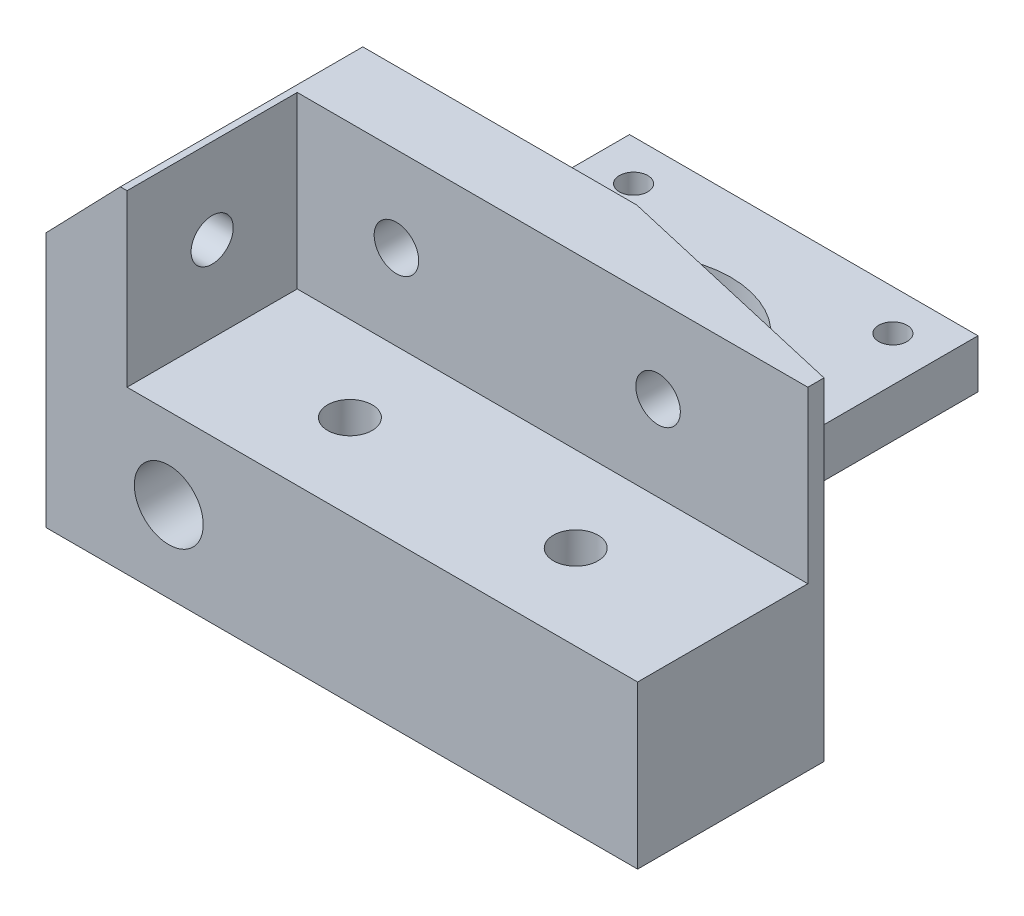
ISO-10303-21;
HEADER;
FILE_DESCRIPTION(('STEP AP214'),'2;1');
FILE_NAME('part.step','',(''),(''),'','','');
FILE_SCHEMA(('AUTOMOTIVE_DESIGN { 1 0 10303 214 1 1 1 1 }'));
ENDSEC;
DATA;
#1=APPLICATION_CONTEXT('core data for automotive mechanical design processes');
#2=APPLICATION_PROTOCOL_DEFINITION('international standard','automotive_design',2000,#1);
#3=PRODUCT_CONTEXT('',#1,'mechanical');
#4=PRODUCT('Part','Part','',(#3));
#5=PRODUCT_RELATED_PRODUCT_CATEGORY('part','',(#4));
#6=PRODUCT_DEFINITION_FORMATION('','',#4);
#7=PRODUCT_DEFINITION_CONTEXT('part definition',#1,'design');
#8=PRODUCT_DEFINITION('design','',#6,#7);
#9=PRODUCT_DEFINITION_SHAPE('','',#8);
#10=(LENGTH_UNIT() NAMED_UNIT(*) SI_UNIT(.MILLI.,.METRE.));
#11=(NAMED_UNIT(*) PLANE_ANGLE_UNIT() SI_UNIT($,.RADIAN.));
#12=(NAMED_UNIT(*) SI_UNIT($,.STERADIAN.) SOLID_ANGLE_UNIT());
#13=UNCERTAINTY_MEASURE_WITH_UNIT(LENGTH_MEASURE(1.E-05),#10,'distance_accuracy_value','');
#14=(GEOMETRIC_REPRESENTATION_CONTEXT(3) GLOBAL_UNCERTAINTY_ASSIGNED_CONTEXT((#13)) GLOBAL_UNIT_ASSIGNED_CONTEXT((#10,
#11,#12)) REPRESENTATION_CONTEXT('',''));
#15=CARTESIAN_POINT('',(0.,0.,0.));
#16=DIRECTION('',(0.,0.,1.));
#17=DIRECTION('',(1.,0.,0.));
#18=AXIS2_PLACEMENT_3D('',#15,#16,#17);
#19=CARTESIAN_POINT('',(-4.73701379067316,0.,32.5250375640439));
#20=DIRECTION('',(0.,1.,0.));
#21=DIRECTION('',(0.,0.,1.));
#22=AXIS2_PLACEMENT_3D('',#19,#20,#21);
#23=CYLINDRICAL_SURFACE('',#22,2.75);
#24=CARTESIAN_POINT('',(-4.73701379067316,20.,32.5250375640439));
#25=DIRECTION('',(0.,1.,0.));
#26=DIRECTION('',(0.,0.,1.));
#27=AXIS2_PLACEMENT_3D('',#24,#25,#26);
#28=CIRCLE('',#27,2.75);
#29=CARTESIAN_POINT('',(-4.73701379067316,20.,35.2750375640439));
#30=VERTEX_POINT('',#29);
#31=EDGE_CURVE('E170',#30,#30,#28,.T.);
#32=ORIENTED_EDGE('',*,*,#31,.T.);
#33=EDGE_LOOP('',(#32));
#34=FACE_BOUND('',#33,.T.);
#35=CARTESIAN_POINT('',(-4.73701379067316,15.5,32.5250375640439));
#36=DIRECTION('',(0.,-1.,0.));
#37=DIRECTION('',(0.,0.,-1.));
#38=AXIS2_PLACEMENT_3D('',#35,#36,#37);
#39=CIRCLE('',#38,2.75);
#40=CARTESIAN_POINT('',(-4.73701379067316,15.5,29.7750375640439));
#41=VERTEX_POINT('',#40);
#42=EDGE_CURVE('E37',#41,#41,#39,.F.);
#43=ORIENTED_EDGE('',*,*,#42,.F.);
#44=EDGE_LOOP('',(#43));
#45=FACE_BOUND('',#44,.T.);
#46=ADVANCED_FACE('F33',(#34,#45),#23,.F.);
#47=CARTESIAN_POINT('',(23.1264020152011,0.,32.5250375640439));
#48=DIRECTION('',(0.,1.,0.));
#49=DIRECTION('',(0.,0.,1.));
#50=AXIS2_PLACEMENT_3D('',#47,#48,#49);
#51=CYLINDRICAL_SURFACE('',#50,2.75);
#52=CARTESIAN_POINT('',(23.1264020152011,20.,32.5250375640439));
#53=DIRECTION('',(0.,1.,0.));
#54=DIRECTION('',(0.,0.,1.));
#55=AXIS2_PLACEMENT_3D('',#52,#53,#54);
#56=CIRCLE('',#55,2.75);
#57=CARTESIAN_POINT('',(23.1264020152011,20.,35.2750375640439));
#58=VERTEX_POINT('',#57);
#59=EDGE_CURVE('E165',#58,#58,#56,.T.);
#60=ORIENTED_EDGE('',*,*,#59,.T.);
#61=EDGE_LOOP('',(#60));
#62=FACE_BOUND('',#61,.T.);
#63=CARTESIAN_POINT('',(23.1264020152011,15.5,32.5250375640439));
#64=DIRECTION('',(0.,-1.,0.));
#65=DIRECTION('',(0.,0.,-1.));
#66=AXIS2_PLACEMENT_3D('',#63,#64,#65);
#67=CIRCLE('',#66,2.75);
#68=CARTESIAN_POINT('',(23.1264020152011,15.5,29.7750375640439));
#69=VERTEX_POINT('',#68);
#70=EDGE_CURVE('E163',#69,#69,#67,.F.);
#71=ORIENTED_EDGE('',*,*,#70,.F.);
#72=EDGE_LOOP('',(#71));
#73=FACE_BOUND('',#72,.T.);
#74=ADVANCED_FACE('F331',(#62,#73),#51,.F.);
#75=CARTESIAN_POINT('',(-31.7370999521845,6.,-28.9749624359561));
#76=DIRECTION('',(1.,0.,0.));
#77=DIRECTION('',(0.,0.,-1.));
#78=AXIS2_PLACEMENT_3D('',#75,#76,#77);
#79=PLANE('',#78);
#80=CARTESIAN_POINT('',(-31.7370999521845,30.5,32.5250375640439));
#81=DIRECTION('',(1.,0.,0.));
#82=DIRECTION('',(0.,0.,-1.));
#83=AXIS2_PLACEMENT_3D('',#80,#81,#82);
#84=CIRCLE('',#83,4.25);
#85=CARTESIAN_POINT('',(-31.7370999521845,31.5,36.6557154745085));
#86=VERTEX_POINT('',#85);
#87=CARTESIAN_POINT('',(-31.7370999521845,31.4999999999999,28.3943596535793));
#88=VERTEX_POINT('',#87);
#89=EDGE_CURVE('E49',#86,#88,#84,.T.);
#90=ORIENTED_EDGE('',*,*,#89,.T.);
#91=DIRECTION('',(0.,0.,-1.));
#92=VECTOR('',#91,1.);
#93=CARTESIAN_POINT('',(-31.7370999521845,31.5,13.1094021442886));
#94=LINE('',#93,#92);
#95=CARTESIAN_POINT('',(-31.7370999521845,31.5,13.1094021442886));
#96=VERTEX_POINT('',#95);
#97=EDGE_CURVE('E55',#88,#96,#94,.T.);
#98=ORIENTED_EDGE('',*,*,#97,.T.);
#99=DIRECTION('',(0.,-1.,0.));
#100=VECTOR('',#99,1.);
#101=CARTESIAN_POINT('',(-31.7370999521845,41.,13.1094021442886));
#102=LINE('',#101,#100);
#103=CARTESIAN_POINT('',(-31.7370999521845,6.,13.1094021442886));
#104=VERTEX_POINT('',#103);
#105=EDGE_CURVE('E141',#96,#104,#102,.T.);
#106=ORIENTED_EDGE('',*,*,#105,.T.);
#107=DIRECTION('',(0.,0.,1.));
#108=VECTOR('',#107,1.);
#109=CARTESIAN_POINT('',(-31.7370999521845,6.,-28.9749624359561));
#110=LINE('',#109,#108);
#111=CARTESIAN_POINT('',(-31.7370999521845,6.,-28.9749624359561));
#112=VERTEX_POINT('',#111);
#113=EDGE_CURVE('E238',#112,#104,#110,.T.);
#114=ORIENTED_EDGE('',*,*,#113,.F.);
#115=DIRECTION('',(0.,-1.,0.));
#116=VECTOR('',#115,1.);
#117=CARTESIAN_POINT('',(-31.7370999521845,6.,-28.9749624359561));
#118=LINE('',#117,#116);
#119=CARTESIAN_POINT('',(-31.7370999521845,0.,-28.9749624359561));
#120=VERTEX_POINT('',#119);
#121=EDGE_CURVE('E262',#112,#120,#118,.T.);
#122=ORIENTED_EDGE('',*,*,#121,.T.);
#123=DIRECTION('',(0.,0.,1.));
#124=VECTOR('',#123,1.);
#125=CARTESIAN_POINT('',(-31.7370999521845,0.,-28.9749624359561));
#126=LINE('',#125,#124);
#127=CARTESIAN_POINT('',(-31.7370999521845,0.,43.0250375640439));
#128=VERTEX_POINT('',#127);
#129=EDGE_CURVE('E276',#120,#128,#126,.T.);
#130=ORIENTED_EDGE('',*,*,#129,.T.);
#131=DIRECTION('',(0.,-1.,0.));
#132=VECTOR('',#131,1.);
#133=CARTESIAN_POINT('',(-31.7370999521845,6.,43.0250375640439));
#134=LINE('',#133,#132);
#135=CARTESIAN_POINT('',(-31.7370999521845,31.5,43.0250375640439));
#136=VERTEX_POINT('',#135);
#137=EDGE_CURVE('E244',#136,#128,#134,.T.);
#138=ORIENTED_EDGE('',*,*,#137,.F.);
#139=DIRECTION('',(0.,0.,-1.));
#140=VECTOR('',#139,1.);
#141=CARTESIAN_POINT('',(-31.7370999521845,31.5,13.1094021442886));
#142=LINE('',#141,#140);
#143=EDGE_CURVE('E129',#136,#86,#142,.T.);
#144=ORIENTED_EDGE('',*,*,#143,.T.);
#145=EDGE_LOOP('',(#90,#98,#106,#114,#122,#130,#138,#144));
#146=FACE_BOUND('',#145,.T.);
#147=ADVANCED_FACE('F127',(#146),#79,.F.);
#148=CARTESIAN_POINT('',(-22.5630565915173,41.,0.));
#149=DIRECTION('',(-0.719339800338652,0.694658370458996,0.));
#150=DIRECTION('',(0.,0.,-1.));
#151=AXIS2_PLACEMENT_3D('',#148,#149,#150);
#152=PLANE('',#151);
#153=ORIENTED_EDGE('',*,*,#97,.F.);
#154=CARTESIAN_POINT('',(-32.7027887269915,30.5,32.5250375640439));
#155=DIRECTION('',(-0.719339800338652,0.694658370458996,0.));
#156=DIRECTION('',(-0.694658370458996,-0.719339800338652,0.));
#157=AXIS2_PLACEMENT_3D('',#154,#155,#156);
#158=ELLIPSE('',#157,5.90819526182088,4.25);
#159=EDGE_CURVE('E11',#88,#86,#158,.F.);
#160=ORIENTED_EDGE('',*,*,#159,.T.);
#161=ORIENTED_EDGE('',*,*,#143,.F.);
#162=DIRECTION('',(-0.694658370458996,-0.719339800338652,0.));
#163=VECTOR('',#162,1.);
#164=CARTESIAN_POINT('',(-22.5630565915173,41.,43.0250375640439));
#165=LINE('',#164,#163);
#166=CARTESIAN_POINT('',(-22.5630565915173,41.,43.0250375640439));
#167=VERTEX_POINT('',#166);
#168=EDGE_CURVE('E135',#167,#136,#165,.T.);
#169=ORIENTED_EDGE('',*,*,#168,.F.);
#170=DIRECTION('',(0.,0.,1.));
#171=VECTOR('',#170,1.);
#172=CARTESIAN_POINT('',(-22.5630565915173,41.,43.0250375640439));
#173=LINE('',#172,#171);
#174=CARTESIAN_POINT('',(-22.5630565915173,41.,13.1094021442886));
#175=VERTEX_POINT('',#174);
#176=EDGE_CURVE('E138',#175,#167,#173,.T.);
#177=ORIENTED_EDGE('',*,*,#176,.F.);
#178=DIRECTION('',(0.694658370458996,0.719339800338652,0.));
#179=VECTOR('',#178,1.);
#180=CARTESIAN_POINT('',(-22.5630565915173,41.,13.1094021442886));
#181=LINE('',#180,#179);
#182=EDGE_CURVE('E42',#96,#175,#181,.T.);
#183=ORIENTED_EDGE('',*,*,#182,.F.);
#184=EDGE_LOOP('',(#153,#160,#161,#169,#177,#183));
#185=FACE_BOUND('',#184,.T.);
#186=ADVANCED_FACE('F35',(#185),#152,.T.);
#187=CARTESIAN_POINT('',(0.,6.,0.));
#188=DIRECTION('',(0.,1.,0.));
#189=DIRECTION('',(0.,0.,1.));
#190=AXIS2_PLACEMENT_3D('',#187,#188,#189);
#191=PLANE('',#190);
#192=DIRECTION('',(-1.,0.,0.));
#193=VECTOR('',#192,1.);
#194=CARTESIAN_POINT('',(11.2629000478155,6.,13.1094021442886));
#195=LINE('',#194,#193);
#196=CARTESIAN_POINT('',(11.2629000478155,6.,13.1094021442886));
#197=VERTEX_POINT('',#196);
#198=EDGE_CURVE('E218',#197,#104,#195,.T.);
#199=ORIENTED_EDGE('',*,*,#198,.F.);
#200=DIRECTION('',(0.,0.,-1.));
#201=VECTOR('',#200,1.);
#202=CARTESIAN_POINT('',(11.2629000478155,6.,-28.9749624359561));
#203=LINE('',#202,#201);
#204=CARTESIAN_POINT('',(11.2629000478155,6.,-28.9749624359561));
#205=VERTEX_POINT('',#204);
#206=EDGE_CURVE('E281',#197,#205,#203,.T.);
#207=ORIENTED_EDGE('',*,*,#206,.T.);
#208=DIRECTION('',(-1.,0.,0.));
#209=VECTOR('',#208,1.);
#210=CARTESIAN_POINT('',(-31.7370999521845,6.,-28.9749624359561));
#211=LINE('',#210,#209);
#212=EDGE_CURVE('E265',#205,#112,#211,.T.);
#213=ORIENTED_EDGE('',*,*,#212,.T.);
#214=ORIENTED_EDGE('',*,*,#113,.T.);
#215=EDGE_LOOP('',(#199,#207,#213,#214));
#216=FACE_BOUND('',#215,.T.);
#217=CARTESIAN_POINT('',(5.76290004781584,6.,8.02503756404347));
#218=DIRECTION('',(0.,1.,0.));
#219=DIRECTION('',(0.,0.,1.));
#220=AXIS2_PLACEMENT_3D('',#217,#218,#219);
#221=CIRCLE('',#220,1.75);
#222=CARTESIAN_POINT('',(5.76290004781584,6.,9.77503756404347));
#223=VERTEX_POINT('',#222);
#224=EDGE_CURVE('E299',#223,#223,#221,.T.);
#225=ORIENTED_EDGE('',*,*,#224,.F.);
#226=EDGE_LOOP('',(#225));
#227=FACE_BOUND('',#226,.T.);
#228=CARTESIAN_POINT('',(-26.2370999521845,6.,-23.9749624359561));
#229=DIRECTION('',(0.,1.,0.));
#230=DIRECTION('',(0.,0.,1.));
#231=AXIS2_PLACEMENT_3D('',#228,#229,#230);
#232=CIRCLE('',#231,1.75);
#233=CARTESIAN_POINT('',(-26.2370999521845,6.,-22.2249624359561));
#234=VERTEX_POINT('',#233);
#235=EDGE_CURVE('E287',#234,#234,#232,.T.);
#236=ORIENTED_EDGE('',*,*,#235,.F.);
#237=EDGE_LOOP('',(#236));
#238=FACE_BOUND('',#237,.T.);
#239=CARTESIAN_POINT('',(-10.2370999521845,6.,-7.97496243595609));
#240=DIRECTION('',(0.,1.,0.));
#241=DIRECTION('',(0.,0.,1.));
#242=AXIS2_PLACEMENT_3D('',#239,#240,#241);
#243=CIRCLE('',#242,12.);
#244=CARTESIAN_POINT('',(-10.2370999521845,6.,4.02503756404391));
#245=VERTEX_POINT('',#244);
#246=EDGE_CURVE('E279',#245,#245,#243,.T.);
#247=ORIENTED_EDGE('',*,*,#246,.F.);
#248=EDGE_LOOP('',(#247));
#249=FACE_BOUND('',#248,.T.);
#250=CARTESIAN_POINT('',(5.76290004781551,6.,-23.9749624359565));
#251=DIRECTION('',(0.,1.,0.));
#252=DIRECTION('',(0.,0.,1.));
#253=AXIS2_PLACEMENT_3D('',#250,#251,#252);
#254=CIRCLE('',#253,1.75);
#255=CARTESIAN_POINT('',(5.76290004781551,6.,-22.2249624359565));
#256=VERTEX_POINT('',#255);
#257=EDGE_CURVE('E293',#256,#256,#254,.T.);
#258=ORIENTED_EDGE('',*,*,#257,.F.);
#259=EDGE_LOOP('',(#258));
#260=FACE_BOUND('',#259,.T.);
#261=CARTESIAN_POINT('',(-26.2370999521842,6.,8.02503756404391));
#262=DIRECTION('',(0.,1.,0.));
#263=DIRECTION('',(0.,0.,1.));
#264=AXIS2_PLACEMENT_3D('',#261,#262,#263);
#265=CIRCLE('',#264,1.75);
#266=CARTESIAN_POINT('',(-26.2370999521842,6.,9.77503756404391));
#267=VERTEX_POINT('',#266);
#268=EDGE_CURVE('E305',#267,#267,#265,.T.);
#269=ORIENTED_EDGE('',*,*,#268,.F.);
#270=EDGE_LOOP('',(#269));
#271=FACE_BOUND('',#270,.T.);
#272=ADVANCED_FACE('F316',(#216,#227,#238,#249,#260,#271),#191,.T.);
#273=CARTESIAN_POINT('',(0.,0.,0.));
#274=DIRECTION('',(0.,1.,0.));
#275=DIRECTION('',(0.,0.,1.));
#276=AXIS2_PLACEMENT_3D('',#273,#274,#275);
#277=PLANE('',#276);
#278=CARTESIAN_POINT('',(-4.73701379067316,0.,32.5250375640439));
#279=DIRECTION('',(0.,-1.,0.));
#280=DIRECTION('',(0.,0.,-1.));
#281=AXIS2_PLACEMENT_3D('',#278,#279,#280);
#282=CIRCLE('',#281,4.25);
#283=CARTESIAN_POINT('',(-4.73701379067316,0.,28.2750375640439));
#284=VERTEX_POINT('',#283);
#285=EDGE_CURVE('E180',#284,#284,#282,.T.);
#286=ORIENTED_EDGE('',*,*,#285,.F.);
#287=EDGE_LOOP('',(#286));
#288=FACE_BOUND('',#287,.T.);
#289=CARTESIAN_POINT('',(23.1264020152011,0.,32.5250375640439));
#290=DIRECTION('',(0.,-1.,0.));
#291=DIRECTION('',(0.,0.,-1.));
#292=AXIS2_PLACEMENT_3D('',#289,#290,#291);
#293=CIRCLE('',#292,4.25);
#294=CARTESIAN_POINT('',(23.1264020152011,0.,28.2750375640439));
#295=VERTEX_POINT('',#294);
#296=EDGE_CURVE('E173',#295,#295,#293,.T.);
#297=ORIENTED_EDGE('',*,*,#296,.F.);
#298=EDGE_LOOP('',(#297));
#299=FACE_BOUND('',#298,.T.);
#300=CARTESIAN_POINT('',(5.76290004781584,0.,8.02503756404347));
#301=DIRECTION('',(0.,1.,0.));
#302=DIRECTION('',(0.,0.,1.));
#303=AXIS2_PLACEMENT_3D('',#300,#301,#302);
#304=CIRCLE('',#303,1.75);
#305=CARTESIAN_POINT('',(5.76290004781584,0.,9.77503756404347));
#306=VERTEX_POINT('',#305);
#307=EDGE_CURVE('E302',#306,#306,#304,.T.);
#308=ORIENTED_EDGE('',*,*,#307,.T.);
#309=EDGE_LOOP('',(#308));
#310=FACE_BOUND('',#309,.T.);
#311=CARTESIAN_POINT('',(-26.2370999521845,0.,-23.9749624359561));
#312=DIRECTION('',(0.,1.,0.));
#313=DIRECTION('',(0.,0.,1.));
#314=AXIS2_PLACEMENT_3D('',#311,#312,#313);
#315=CIRCLE('',#314,1.75);
#316=CARTESIAN_POINT('',(-26.2370999521845,0.,-22.2249624359561));
#317=VERTEX_POINT('',#316);
#318=EDGE_CURVE('E290',#317,#317,#315,.T.);
#319=ORIENTED_EDGE('',*,*,#318,.T.);
#320=EDGE_LOOP('',(#319));
#321=FACE_BOUND('',#320,.T.);
#322=ORIENTED_EDGE('',*,*,#129,.F.);
#323=DIRECTION('',(-1.,0.,0.));
#324=VECTOR('',#323,1.);
#325=CARTESIAN_POINT('',(-31.7370999521845,0.,-28.9749624359561));
#326=LINE('',#325,#324);
#327=CARTESIAN_POINT('',(11.2629000478155,0.,-28.9749624359561));
#328=VERTEX_POINT('',#327);
#329=EDGE_CURVE('E266',#328,#120,#326,.T.);
#330=ORIENTED_EDGE('',*,*,#329,.F.);
#331=DIRECTION('',(0.,0.,-1.));
#332=VECTOR('',#331,1.);
#333=CARTESIAN_POINT('',(11.2629000478155,0.,-28.9749624359561));
#334=LINE('',#333,#332);
#335=CARTESIAN_POINT('',(11.2629000478155,0.,13.1094021442886));
#336=VERTEX_POINT('',#335);
#337=EDGE_CURVE('E268',#336,#328,#334,.T.);
#338=ORIENTED_EDGE('',*,*,#337,.F.);
#339=DIRECTION('',(-0.974444127815744,0.,-0.224630010829839));
#340=VECTOR('',#339,1.);
#341=CARTESIAN_POINT('',(41.2629000478155,0.,20.0250375640439));
#342=LINE('',#341,#340);
#343=CARTESIAN_POINT('',(41.2629000478155,0.,20.0250375640439));
#344=VERTEX_POINT('',#343);
#345=EDGE_CURVE('E270',#344,#336,#342,.T.);
#346=ORIENTED_EDGE('',*,*,#345,.F.);
#347=DIRECTION('',(0.,0.,-1.));
#348=VECTOR('',#347,1.);
#349=CARTESIAN_POINT('',(41.2629000478155,0.,43.0250375640439));
#350=LINE('',#349,#348);
#351=CARTESIAN_POINT('',(41.2629000478155,0.,43.0250375640439));
#352=VERTEX_POINT('',#351);
#353=EDGE_CURVE('E272',#352,#344,#350,.T.);
#354=ORIENTED_EDGE('',*,*,#353,.F.);
#355=DIRECTION('',(1.,0.,0.));
#356=VECTOR('',#355,1.);
#357=CARTESIAN_POINT('',(-31.7370999521845,0.,43.0250375640439));
#358=LINE('',#357,#356);
#359=EDGE_CURVE('E274',#128,#352,#358,.T.);
#360=ORIENTED_EDGE('',*,*,#359,.F.);
#361=EDGE_LOOP('',(#322,#330,#338,#346,#354,#360));
#362=FACE_BOUND('',#361,.T.);
#363=CARTESIAN_POINT('',(-10.2370999521845,0.,-7.97496243595609));
#364=DIRECTION('',(0.,1.,0.));
#365=DIRECTION('',(0.,0.,1.));
#366=AXIS2_PLACEMENT_3D('',#363,#364,#365);
#367=CIRCLE('',#366,12.);
#368=CARTESIAN_POINT('',(-10.2370999521845,0.,4.02503756404391));
#369=VERTEX_POINT('',#368);
#370=EDGE_CURVE('E284',#369,#369,#367,.T.);
#371=ORIENTED_EDGE('',*,*,#370,.T.);
#372=EDGE_LOOP('',(#371));
#373=FACE_BOUND('',#372,.T.);
#374=CARTESIAN_POINT('',(5.76290004781551,0.,-23.9749624359565));
#375=DIRECTION('',(0.,1.,0.));
#376=DIRECTION('',(0.,0.,1.));
#377=AXIS2_PLACEMENT_3D('',#374,#375,#376);
#378=CIRCLE('',#377,1.75);
#379=CARTESIAN_POINT('',(5.76290004781551,0.,-22.2249624359565));
#380=VERTEX_POINT('',#379);
#381=EDGE_CURVE('E296',#380,#380,#378,.T.);
#382=ORIENTED_EDGE('',*,*,#381,.T.);
#383=EDGE_LOOP('',(#382));
#384=FACE_BOUND('',#383,.T.);
#385=CARTESIAN_POINT('',(-26.2370999521842,0.,8.02503756404391));
#386=DIRECTION('',(0.,1.,0.));
#387=DIRECTION('',(0.,0.,1.));
#388=AXIS2_PLACEMENT_3D('',#385,#386,#387);
#389=CIRCLE('',#388,1.75);
#390=CARTESIAN_POINT('',(-26.2370999521842,0.,9.77503756404391));
#391=VERTEX_POINT('',#390);
#392=EDGE_CURVE('E308',#391,#391,#389,.T.);
#393=ORIENTED_EDGE('',*,*,#392,.T.);
#394=EDGE_LOOP('',(#393));
#395=FACE_BOUND('',#394,.T.);
#396=ADVANCED_FACE('F318',(#288,#299,#310,#321,#362,#373,#384,#395),#277,.F.);
#397=CARTESIAN_POINT('',(-31.7370999521845,6.,43.0250375640439));
#398=DIRECTION('',(0.,0.,-1.));
#399=DIRECTION('',(-1.,0.,0.));
#400=AXIS2_PLACEMENT_3D('',#397,#398,#399);
#401=PLANE('',#400);
#402=CARTESIAN_POINT('',(-16.5870999521845,10.,43.0250375640439));
#403=DIRECTION('',(0.,0.,1.));
#404=DIRECTION('',(1.,0.,0.));
#405=AXIS2_PLACEMENT_3D('',#402,#403,#404);
#406=CIRCLE('',#405,4.25);
#407=CARTESIAN_POINT('',(-12.3370999521845,10.,43.0250375640439));
#408=VERTEX_POINT('',#407);
#409=EDGE_CURVE('E628',#408,#408,#406,.T.);
#410=ORIENTED_EDGE('',*,*,#409,.F.);
#411=EDGE_LOOP('',(#410));
#412=FACE_BOUND('',#411,.T.);
#413=DIRECTION('',(1.,0.,0.));
#414=VECTOR('',#413,1.);
#415=CARTESIAN_POINT('',(-31.7370999521845,41.,43.0250375640439));
#416=LINE('',#415,#414);
#417=CARTESIAN_POINT('',(-21.7370999521845,41.,43.0250375640439));
#418=VERTEX_POINT('',#417);
#419=EDGE_CURVE('E229',#167,#418,#416,.T.);
#420=ORIENTED_EDGE('',*,*,#419,.F.);
#421=ORIENTED_EDGE('',*,*,#168,.T.);
#422=ORIENTED_EDGE('',*,*,#137,.T.);
#423=ORIENTED_EDGE('',*,*,#359,.T.);
#424=DIRECTION('',(0.,-1.,0.));
#425=VECTOR('',#424,1.);
#426=CARTESIAN_POINT('',(41.2629000478155,6.,43.0250375640439));
#427=LINE('',#426,#425);
#428=CARTESIAN_POINT('',(41.2629000478155,20.,43.0250375640439));
#429=VERTEX_POINT('',#428);
#430=EDGE_CURVE('E247',#429,#352,#427,.T.);
#431=ORIENTED_EDGE('',*,*,#430,.F.);
#432=DIRECTION('',(1.,0.,0.));
#433=VECTOR('',#432,1.);
#434=CARTESIAN_POINT('',(41.2629000478155,20.,43.0250375640439));
#435=LINE('',#434,#433);
#436=CARTESIAN_POINT('',(-21.7370999521845,20.,43.0250375640439));
#437=VERTEX_POINT('',#436);
#438=EDGE_CURVE('E208',#437,#429,#435,.T.);
#439=ORIENTED_EDGE('',*,*,#438,.F.);
#440=DIRECTION('',(0.,1.,0.));
#441=VECTOR('',#440,1.);
#442=CARTESIAN_POINT('',(-21.7370999521845,20.,43.0250375640439));
#443=LINE('',#442,#441);
#444=EDGE_CURVE('E215',#437,#418,#443,.T.);
#445=ORIENTED_EDGE('',*,*,#444,.T.);
#446=EDGE_LOOP('',(#420,#421,#422,#423,#431,#439,#445));
#447=FACE_BOUND('',#446,.T.);
#448=ADVANCED_FACE('F325',(#412,#447),#401,.F.);
#449=CARTESIAN_POINT('',(41.2629000478155,6.,43.0250375640439));
#450=DIRECTION('',(-1.,0.,0.));
#451=DIRECTION('',(0.,0.,1.));
#452=AXIS2_PLACEMENT_3D('',#449,#450,#451);
#453=PLANE('',#452);
#454=DIRECTION('',(0.,0.,-1.));
#455=VECTOR('',#454,1.);
#456=CARTESIAN_POINT('',(41.2629000478155,41.,43.0250375640439));
#457=LINE('',#456,#455);
#458=CARTESIAN_POINT('',(41.2629000478155,41.,22.0250375640439));
#459=VERTEX_POINT('',#458);
#460=CARTESIAN_POINT('',(41.2629000478155,41.,20.0250375640439));
#461=VERTEX_POINT('',#460);
#462=EDGE_CURVE('E222',#459,#461,#457,.T.);
#463=ORIENTED_EDGE('',*,*,#462,.F.);
#464=DIRECTION('',(0.,1.,0.));
#465=VECTOR('',#464,1.);
#466=CARTESIAN_POINT('',(41.2629000478155,20.,22.0250375640439));
#467=LINE('',#466,#465);
#468=CARTESIAN_POINT('',(41.2629000478155,20.,22.0250375640439));
#469=VERTEX_POINT('',#468);
#470=EDGE_CURVE('E210',#469,#459,#467,.T.);
#471=ORIENTED_EDGE('',*,*,#470,.F.);
#472=DIRECTION('',(0.,0.,-1.));
#473=VECTOR('',#472,1.);
#474=CARTESIAN_POINT('',(41.2629000478155,20.,43.0250375640439));
#475=LINE('',#474,#473);
#476=EDGE_CURVE('E198',#429,#469,#475,.T.);
#477=ORIENTED_EDGE('',*,*,#476,.F.);
#478=ORIENTED_EDGE('',*,*,#430,.T.);
#479=ORIENTED_EDGE('',*,*,#353,.T.);
#480=DIRECTION('',(0.,-1.,0.));
#481=VECTOR('',#480,1.);
#482=CARTESIAN_POINT('',(41.2629000478155,6.,20.0250375640439));
#483=LINE('',#482,#481);
#484=EDGE_CURVE('E251',#461,#344,#483,.T.);
#485=ORIENTED_EDGE('',*,*,#484,.F.);
#486=EDGE_LOOP('',(#463,#471,#477,#478,#479,#485));
#487=FACE_BOUND('',#486,.T.);
#488=ADVANCED_FACE('F441',(#487),#453,.F.);
#489=CARTESIAN_POINT('',(41.2629000478155,6.,20.0250375640439));
#490=DIRECTION('',(-0.224630010829839,0.,0.974444127815744));
#491=DIRECTION('',(0.974444127815744,0.,0.224630010829839));
#492=AXIS2_PLACEMENT_3D('',#489,#490,#491);
#493=PLANE('',#492);
#494=CARTESIAN_POINT('',(22.785725254305,30.5,15.7656574154102));
#495=DIRECTION('',(-0.224630010829839,0.,0.974444127815744));
#496=DIRECTION('',(0.974444127815744,0.,0.224630010829839));
#497=AXIS2_PLACEMENT_3D('',#494,#495,#496);
#498=ELLIPSE('',#497,4.36146093827519,4.25);
#499=CARTESIAN_POINT('',(27.035725254305,30.5,16.7453724332089));
#500=VERTEX_POINT('',#499);
#501=EDGE_CURVE('E160',#500,#500,#498,.T.);
#502=ORIENTED_EDGE('',*,*,#501,.T.);
#503=EDGE_LOOP('',(#502));
#504=FACE_BOUND('',#503,.T.);
#505=ORIENTED_EDGE('',*,*,#345,.T.);
#506=DIRECTION('',(0.,-1.,0.));
#507=VECTOR('',#506,1.);
#508=CARTESIAN_POINT('',(11.2629000478155,6.,13.1094021442886));
#509=LINE('',#508,#507);
#510=EDGE_CURVE('E256',#197,#336,#509,.T.);
#511=ORIENTED_EDGE('',*,*,#510,.F.);
#512=DIRECTION('',(0.,-1.,0.));
#513=VECTOR('',#512,1.);
#514=CARTESIAN_POINT('',(11.2629000478155,41.,13.1094021442886));
#515=LINE('',#514,#513);
#516=CARTESIAN_POINT('',(11.2629000478155,41.,13.1094021442886));
#517=VERTEX_POINT('',#516);
#518=EDGE_CURVE('E233',#517,#197,#515,.T.);
#519=ORIENTED_EDGE('',*,*,#518,.F.);
#520=DIRECTION('',(-0.974444127815744,0.,-0.224630010829839));
#521=VECTOR('',#520,1.);
#522=CARTESIAN_POINT('',(41.2629000478155,41.,20.0250375640439));
#523=LINE('',#522,#521);
#524=EDGE_CURVE('E224',#461,#517,#523,.T.);
#525=ORIENTED_EDGE('',*,*,#524,.F.);
#526=ORIENTED_EDGE('',*,*,#484,.T.);
#527=EDGE_LOOP('',(#505,#511,#519,#525,#526));
#528=FACE_BOUND('',#527,.T.);
#529=ADVANCED_FACE('F435',(#504,#528),#493,.F.);
#530=CARTESIAN_POINT('',(11.2629000478155,6.,-28.9749624359561));
#531=DIRECTION('',(-1.,0.,0.));
#532=DIRECTION('',(0.,0.,1.));
#533=AXIS2_PLACEMENT_3D('',#530,#531,#532);
#534=PLANE('',#533);
#535=ORIENTED_EDGE('',*,*,#337,.T.);
#536=DIRECTION('',(0.,-1.,0.));
#537=VECTOR('',#536,1.);
#538=CARTESIAN_POINT('',(11.2629000478155,6.,-28.9749624359561));
#539=LINE('',#538,#537);
#540=EDGE_CURVE('E259',#205,#328,#539,.T.);
#541=ORIENTED_EDGE('',*,*,#540,.F.);
#542=ORIENTED_EDGE('',*,*,#206,.F.);
#543=ORIENTED_EDGE('',*,*,#510,.T.);
#544=EDGE_LOOP('',(#535,#541,#542,#543));
#545=FACE_BOUND('',#544,.T.);
#546=ADVANCED_FACE('F417',(#545),#534,.F.);
#547=CARTESIAN_POINT('',(-31.7370999521845,6.,-28.9749624359561));
#548=DIRECTION('',(0.,0.,1.));
#549=DIRECTION('',(1.,0.,0.));
#550=AXIS2_PLACEMENT_3D('',#547,#548,#549);
#551=PLANE('',#550);
#552=ORIENTED_EDGE('',*,*,#329,.T.);
#553=ORIENTED_EDGE('',*,*,#121,.F.);
#554=ORIENTED_EDGE('',*,*,#212,.F.);
#555=ORIENTED_EDGE('',*,*,#540,.T.);
#556=EDGE_LOOP('',(#552,#553,#554,#555));
#557=FACE_BOUND('',#556,.T.);
#558=ADVANCED_FACE('F412',(#557),#551,.F.);
#559=CARTESIAN_POINT('',(-10.2370999521845,6.,-7.97496243595609));
#560=DIRECTION('',(0.,-1.,0.));
#561=DIRECTION('',(0.,0.,-1.));
#562=AXIS2_PLACEMENT_3D('',#559,#560,#561);
#563=CYLINDRICAL_SURFACE('',#562,12.);
#564=ORIENTED_EDGE('',*,*,#246,.T.);
#565=EDGE_LOOP('',(#564));
#566=FACE_BOUND('',#565,.T.);
#567=ORIENTED_EDGE('',*,*,#370,.F.);
#568=EDGE_LOOP('',(#567));
#569=FACE_BOUND('',#568,.T.);
#570=ADVANCED_FACE('F409',(#566,#569),#563,.F.);
#571=CARTESIAN_POINT('',(-26.2370999521845,6.,-23.9749624359561));
#572=DIRECTION('',(0.,-1.,0.));
#573=DIRECTION('',(0.,0.,-1.));
#574=AXIS2_PLACEMENT_3D('',#571,#572,#573);
#575=CYLINDRICAL_SURFACE('',#574,1.75);
#576=ORIENTED_EDGE('',*,*,#235,.T.);
#577=EDGE_LOOP('',(#576));
#578=FACE_BOUND('',#577,.T.);
#579=ORIENTED_EDGE('',*,*,#318,.F.);
#580=EDGE_LOOP('',(#579));
#581=FACE_BOUND('',#580,.T.);
#582=ADVANCED_FACE('F406',(#578,#581),#575,.F.);
#583=CARTESIAN_POINT('',(5.76290004781551,6.,-23.9749624359565));
#584=DIRECTION('',(0.,-1.,0.));
#585=DIRECTION('',(0.,0.,-1.));
#586=AXIS2_PLACEMENT_3D('',#583,#584,#585);
#587=CYLINDRICAL_SURFACE('',#586,1.75);
#588=ORIENTED_EDGE('',*,*,#257,.T.);
#589=EDGE_LOOP('',(#588));
#590=FACE_BOUND('',#589,.T.);
#591=ORIENTED_EDGE('',*,*,#381,.F.);
#592=EDGE_LOOP('',(#591));
#593=FACE_BOUND('',#592,.T.);
#594=ADVANCED_FACE('F402',(#590,#593),#587,.F.);
#595=CARTESIAN_POINT('',(5.76290004781584,6.,8.02503756404347));
#596=DIRECTION('',(0.,-1.,0.));
#597=DIRECTION('',(0.,0.,-1.));
#598=AXIS2_PLACEMENT_3D('',#595,#596,#597);
#599=CYLINDRICAL_SURFACE('',#598,1.75);
#600=ORIENTED_EDGE('',*,*,#224,.T.);
#601=EDGE_LOOP('',(#600));
#602=FACE_BOUND('',#601,.T.);
#603=ORIENTED_EDGE('',*,*,#307,.F.);
#604=EDGE_LOOP('',(#603));
#605=FACE_BOUND('',#604,.T.);
#606=ADVANCED_FACE('F399',(#602,#605),#599,.F.);
#607=CARTESIAN_POINT('',(-26.2370999521842,6.,8.02503756404391));
#608=DIRECTION('',(0.,-1.,0.));
#609=DIRECTION('',(0.,0.,-1.));
#610=AXIS2_PLACEMENT_3D('',#607,#608,#609);
#611=CYLINDRICAL_SURFACE('',#610,1.75);
#612=ORIENTED_EDGE('',*,*,#268,.T.);
#613=EDGE_LOOP('',(#612));
#614=FACE_BOUND('',#613,.T.);
#615=ORIENTED_EDGE('',*,*,#392,.F.);
#616=EDGE_LOOP('',(#615));
#617=FACE_BOUND('',#616,.T.);
#618=ADVANCED_FACE('F313',(#614,#617),#611,.F.);
#619=CARTESIAN_POINT('',(11.2629000478155,41.,13.1094021442886));
#620=DIRECTION('',(0.,0.,1.));
#621=DIRECTION('',(1.,0.,0.));
#622=AXIS2_PLACEMENT_3D('',#619,#620,#621);
#623=PLANE('',#622);
#624=CARTESIAN_POINT('',(-9.49570897630596,30.5,13.1094021442886));
#625=DIRECTION('',(0.,0.,1.));
#626=DIRECTION('',(1.,0.,0.));
#627=AXIS2_PLACEMENT_3D('',#624,#625,#626);
#628=CIRCLE('',#627,4.25);
#629=CARTESIAN_POINT('',(-5.24570897630596,30.5,13.1094021442886));
#630=VERTEX_POINT('',#629);
#631=EDGE_CURVE('E152',#630,#630,#628,.T.);
#632=ORIENTED_EDGE('',*,*,#631,.T.);
#633=EDGE_LOOP('',(#632));
#634=FACE_BOUND('',#633,.T.);
#635=ORIENTED_EDGE('',*,*,#105,.F.);
#636=ORIENTED_EDGE('',*,*,#182,.T.);
#637=DIRECTION('',(-1.,0.,0.));
#638=VECTOR('',#637,1.);
#639=CARTESIAN_POINT('',(11.2629000478155,41.,13.1094021442886));
#640=LINE('',#639,#638);
#641=EDGE_CURVE('E226',#517,#175,#640,.T.);
#642=ORIENTED_EDGE('',*,*,#641,.F.);
#643=ORIENTED_EDGE('',*,*,#518,.T.);
#644=ORIENTED_EDGE('',*,*,#198,.T.);
#645=EDGE_LOOP('',(#635,#636,#642,#643,#644));
#646=FACE_BOUND('',#645,.T.);
#647=ADVANCED_FACE('F393',(#634,#646),#623,.F.);
#648=CARTESIAN_POINT('',(0.,41.,0.));
#649=DIRECTION('',(0.,1.,0.));
#650=DIRECTION('',(0.,0.,1.));
#651=AXIS2_PLACEMENT_3D('',#648,#649,#650);
#652=PLANE('',#651);
#653=ORIENTED_EDGE('',*,*,#641,.T.);
#654=ORIENTED_EDGE('',*,*,#176,.T.);
#655=ORIENTED_EDGE('',*,*,#419,.T.);
#656=DIRECTION('',(0.,0.,1.));
#657=VECTOR('',#656,1.);
#658=CARTESIAN_POINT('',(-21.7370999521845,41.,43.0250375640439));
#659=LINE('',#658,#657);
#660=CARTESIAN_POINT('',(-21.7370999521845,41.,22.0250375640439));
#661=VERTEX_POINT('',#660);
#662=EDGE_CURVE('E202',#661,#418,#659,.T.);
#663=ORIENTED_EDGE('',*,*,#662,.F.);
#664=DIRECTION('',(-1.,0.,0.));
#665=VECTOR('',#664,1.);
#666=CARTESIAN_POINT('',(41.2629000478155,41.,22.0250375640439));
#667=LINE('',#666,#665);
#668=EDGE_CURVE('E197',#459,#661,#667,.T.);
#669=ORIENTED_EDGE('',*,*,#668,.F.);
#670=ORIENTED_EDGE('',*,*,#462,.T.);
#671=ORIENTED_EDGE('',*,*,#524,.T.);
#672=EDGE_LOOP('',(#653,#654,#655,#663,#669,#670,#671));
#673=FACE_BOUND('',#672,.T.);
#674=ADVANCED_FACE('F386',(#673),#652,.T.);
#675=CARTESIAN_POINT('',(-21.7370999521845,20.,43.0250375640439));
#676=DIRECTION('',(-1.,0.,0.));
#677=DIRECTION('',(0.,0.,1.));
#678=AXIS2_PLACEMENT_3D('',#675,#676,#677);
#679=PLANE('',#678);
#680=CARTESIAN_POINT('',(-21.7370999521845,30.5,32.5250375640439));
#681=DIRECTION('',(1.,0.,0.));
#682=DIRECTION('',(0.,0.,-1.));
#683=AXIS2_PLACEMENT_3D('',#680,#681,#682);
#684=CIRCLE('',#683,2.6);
#685=CARTESIAN_POINT('',(-21.7370999521845,30.5,29.9250375640439));
#686=VERTEX_POINT('',#685);
#687=EDGE_CURVE('E148',#686,#686,#684,.T.);
#688=ORIENTED_EDGE('',*,*,#687,.F.);
#689=EDGE_LOOP('',(#688));
#690=FACE_BOUND('',#689,.T.);
#691=ORIENTED_EDGE('',*,*,#662,.T.);
#692=ORIENTED_EDGE('',*,*,#444,.F.);
#693=DIRECTION('',(0.,0.,1.));
#694=VECTOR('',#693,1.);
#695=CARTESIAN_POINT('',(-21.7370999521845,20.,43.0250375640439));
#696=LINE('',#695,#694);
#697=CARTESIAN_POINT('',(-21.7370999521845,20.,22.0250375640439));
#698=VERTEX_POINT('',#697);
#699=EDGE_CURVE('E205',#698,#437,#696,.T.);
#700=ORIENTED_EDGE('',*,*,#699,.F.);
#701=DIRECTION('',(0.,1.,0.));
#702=VECTOR('',#701,1.);
#703=CARTESIAN_POINT('',(-21.7370999521845,20.,22.0250375640439));
#704=LINE('',#703,#702);
#705=EDGE_CURVE('E219',#698,#661,#704,.T.);
#706=ORIENTED_EDGE('',*,*,#705,.T.);
#707=EDGE_LOOP('',(#691,#692,#700,#706));
#708=FACE_BOUND('',#707,.T.);
#709=ADVANCED_FACE('F383',(#690,#708),#679,.F.);
#710=CARTESIAN_POINT('',(41.2629000478155,20.,22.0250375640439));
#711=DIRECTION('',(0.,0.,-1.));
#712=DIRECTION('',(-1.,0.,0.));
#713=AXIS2_PLACEMENT_3D('',#710,#711,#712);
#714=PLANE('',#713);
#715=CARTESIAN_POINT('',(22.785725254305,30.5,22.0250375640439));
#716=DIRECTION('',(0.,0.,1.));
#717=DIRECTION('',(1.,0.,0.));
#718=AXIS2_PLACEMENT_3D('',#715,#716,#717);
#719=CIRCLE('',#718,2.75);
#720=CARTESIAN_POINT('',(25.535725254305,30.5,22.0250375640439));
#721=VERTEX_POINT('',#720);
#722=EDGE_CURVE('E156',#721,#721,#719,.T.);
#723=ORIENTED_EDGE('',*,*,#722,.F.);
#724=EDGE_LOOP('',(#723));
#725=FACE_BOUND('',#724,.T.);
#726=CARTESIAN_POINT('',(-9.49570897630596,30.5,22.0250375640439));
#727=DIRECTION('',(0.,0.,1.));
#728=DIRECTION('',(1.,0.,0.));
#729=AXIS2_PLACEMENT_3D('',#726,#727,#728);
#730=CIRCLE('',#729,2.75);
#731=CARTESIAN_POINT('',(-6.74570897630596,30.5,22.0250375640439));
#732=VERTEX_POINT('',#731);
#733=EDGE_CURVE('E131',#732,#732,#730,.T.);
#734=ORIENTED_EDGE('',*,*,#733,.F.);
#735=EDGE_LOOP('',(#734));
#736=FACE_BOUND('',#735,.T.);
#737=ORIENTED_EDGE('',*,*,#668,.T.);
#738=ORIENTED_EDGE('',*,*,#705,.F.);
#739=DIRECTION('',(-1.,0.,0.));
#740=VECTOR('',#739,1.);
#741=CARTESIAN_POINT('',(41.2629000478155,20.,22.0250375640439));
#742=LINE('',#741,#740);
#743=EDGE_CURVE('E201',#469,#698,#742,.T.);
#744=ORIENTED_EDGE('',*,*,#743,.F.);
#745=ORIENTED_EDGE('',*,*,#470,.T.);
#746=EDGE_LOOP('',(#737,#738,#744,#745));
#747=FACE_BOUND('',#746,.T.);
#748=ADVANCED_FACE('F381',(#725,#736,#747),#714,.F.);
#749=CARTESIAN_POINT('',(0.,20.,0.));
#750=DIRECTION('',(0.,1.,0.));
#751=DIRECTION('',(0.,0.,1.));
#752=AXIS2_PLACEMENT_3D('',#749,#750,#751);
#753=PLANE('',#752);
#754=ORIENTED_EDGE('',*,*,#59,.F.);
#755=EDGE_LOOP('',(#754));
#756=FACE_BOUND('',#755,.T.);
#757=ORIENTED_EDGE('',*,*,#31,.F.);
#758=EDGE_LOOP('',(#757));
#759=FACE_BOUND('',#758,.T.);
#760=ORIENTED_EDGE('',*,*,#476,.T.);
#761=ORIENTED_EDGE('',*,*,#743,.T.);
#762=ORIENTED_EDGE('',*,*,#699,.T.);
#763=ORIENTED_EDGE('',*,*,#438,.T.);
#764=EDGE_LOOP('',(#760,#761,#762,#763));
#765=FACE_BOUND('',#764,.T.);
#766=ADVANCED_FACE('F377',(#756,#759,#765),#753,.T.);
#767=CARTESIAN_POINT('',(-31.7371499521845,30.5,32.5250375640439));
#768=DIRECTION('',(1.,0.,0.));
#769=DIRECTION('',(0.,0.,-1.));
#770=AXIS2_PLACEMENT_3D('',#767,#768,#769);
#771=CYLINDRICAL_SURFACE('',#770,2.6);
#772=CARTESIAN_POINT('',(-26.7370999521845,30.5,32.5250375640439));
#773=DIRECTION('',(1.,0.,0.));
#774=DIRECTION('',(0.,0.,-1.));
#775=AXIS2_PLACEMENT_3D('',#772,#773,#774);
#776=CIRCLE('',#775,2.6);
#777=CARTESIAN_POINT('',(-26.7370999521845,30.5,29.9250375640439));
#778=VERTEX_POINT('',#777);
#779=EDGE_CURVE('E145',#778,#778,#776,.F.);
#780=ORIENTED_EDGE('',*,*,#779,.T.);
#781=EDGE_LOOP('',(#780));
#782=FACE_BOUND('',#781,.T.);
#783=ORIENTED_EDGE('',*,*,#687,.T.);
#784=EDGE_LOOP('',(#783));
#785=FACE_BOUND('',#784,.T.);
#786=ADVANCED_FACE('F370',(#782,#785),#771,.F.);
#787=CARTESIAN_POINT('',(-26.7370999521845,30.5,32.5250375640439));
#788=DIRECTION('',(1.,0.,0.));
#789=DIRECTION('',(0.,0.,-1.));
#790=AXIS2_PLACEMENT_3D('',#787,#788,#789);
#791=PLANE('',#790);
#792=CARTESIAN_POINT('',(-26.7370999521845,30.5,32.5250375640439));
#793=DIRECTION('',(1.,0.,0.));
#794=DIRECTION('',(0.,0.,-1.));
#795=AXIS2_PLACEMENT_3D('',#792,#793,#794);
#796=CIRCLE('',#795,4.25);
#797=CARTESIAN_POINT('',(-26.7370999521845,30.5,28.2750375640439));
#798=VERTEX_POINT('',#797);
#799=EDGE_CURVE('E130',#798,#798,#796,.T.);
#800=ORIENTED_EDGE('',*,*,#799,.F.);
#801=EDGE_LOOP('',(#800));
#802=FACE_BOUND('',#801,.T.);
#803=ORIENTED_EDGE('',*,*,#779,.F.);
#804=EDGE_LOOP('',(#803));
#805=FACE_BOUND('',#804,.T.);
#806=ADVANCED_FACE('F367',(#802,#805),#791,.F.);
#807=CARTESIAN_POINT('',(-26.7370999521845,30.5,32.5250375640439));
#808=DIRECTION('',(-1.,0.,0.));
#809=DIRECTION('',(0.,0.,1.));
#810=AXIS2_PLACEMENT_3D('',#807,#808,#809);
#811=CYLINDRICAL_SURFACE('',#810,4.25);
#812=ORIENTED_EDGE('',*,*,#799,.T.);
#813=EDGE_LOOP('',(#812));
#814=FACE_BOUND('',#813,.T.);
#815=ORIENTED_EDGE('',*,*,#89,.F.);
#816=ORIENTED_EDGE('',*,*,#159,.F.);
#817=EDGE_LOOP('',(#815,#816));
#818=FACE_BOUND('',#817,.T.);
#819=ADVANCED_FACE('F123',(#814,#818),#811,.F.);
#820=CARTESIAN_POINT('',(-9.49570897630596,30.5,-28.9749874359561));
#821=DIRECTION('',(0.,0.,1.));
#822=DIRECTION('',(1.,0.,0.));
#823=AXIS2_PLACEMENT_3D('',#820,#821,#822);
#824=CYLINDRICAL_SURFACE('',#823,2.75);
#825=CARTESIAN_POINT('',(-9.49570897630596,30.5,18.0250375640439));
#826=DIRECTION('',(0.,0.,1.));
#827=DIRECTION('',(1.,0.,0.));
#828=AXIS2_PLACEMENT_3D('',#825,#826,#827);
#829=CIRCLE('',#828,2.75);
#830=CARTESIAN_POINT('',(-6.74570897630596,30.5,18.0250375640439));
#831=VERTEX_POINT('',#830);
#832=EDGE_CURVE('E149',#831,#831,#829,.F.);
#833=ORIENTED_EDGE('',*,*,#832,.T.);
#834=EDGE_LOOP('',(#833));
#835=FACE_BOUND('',#834,.T.);
#836=ORIENTED_EDGE('',*,*,#733,.T.);
#837=EDGE_LOOP('',(#836));
#838=FACE_BOUND('',#837,.T.);
#839=ADVANCED_FACE('F362',(#835,#838),#824,.F.);
#840=CARTESIAN_POINT('',(22.785725254305,30.5,-28.9749874359561));
#841=DIRECTION('',(0.,0.,1.));
#842=DIRECTION('',(1.,0.,0.));
#843=AXIS2_PLACEMENT_3D('',#840,#841,#842);
#844=CYLINDRICAL_SURFACE('',#843,2.75);
#845=CARTESIAN_POINT('',(22.785725254305,30.5,18.0250375640439));
#846=DIRECTION('',(0.,0.,1.));
#847=DIRECTION('',(1.,0.,0.));
#848=AXIS2_PLACEMENT_3D('',#845,#846,#847);
#849=CIRCLE('',#848,2.75);
#850=CARTESIAN_POINT('',(25.535725254305,30.5,18.0250375640439));
#851=VERTEX_POINT('',#850);
#852=EDGE_CURVE('E157',#851,#851,#849,.F.);
#853=ORIENTED_EDGE('',*,*,#852,.T.);
#854=EDGE_LOOP('',(#853));
#855=FACE_BOUND('',#854,.T.);
#856=ORIENTED_EDGE('',*,*,#722,.T.);
#857=EDGE_LOOP('',(#856));
#858=FACE_BOUND('',#857,.T.);
#859=ADVANCED_FACE('F358',(#855,#858),#844,.F.);
#860=CARTESIAN_POINT('',(-9.49570897630596,30.5,13.0250375640439));
#861=DIRECTION('',(0.,0.,1.));
#862=DIRECTION('',(1.,0.,0.));
#863=AXIS2_PLACEMENT_3D('',#860,#861,#862);
#864=CYLINDRICAL_SURFACE('',#863,4.25);
#865=CARTESIAN_POINT('',(-9.49570897630596,30.5,18.0250375640439));
#866=DIRECTION('',(0.,0.,1.));
#867=DIRECTION('',(1.,0.,0.));
#868=AXIS2_PLACEMENT_3D('',#865,#866,#867);
#869=CIRCLE('',#868,4.25);
#870=CARTESIAN_POINT('',(-5.24570897630596,30.5,18.0250375640439));
#871=VERTEX_POINT('',#870);
#872=EDGE_CURVE('E153',#871,#871,#869,.T.);
#873=ORIENTED_EDGE('',*,*,#872,.T.);
#874=EDGE_LOOP('',(#873));
#875=FACE_BOUND('',#874,.T.);
#876=ORIENTED_EDGE('',*,*,#631,.F.);
#877=EDGE_LOOP('',(#876));
#878=FACE_BOUND('',#877,.T.);
#879=ADVANCED_FACE('F354',(#875,#878),#864,.F.);
#880=CARTESIAN_POINT('',(-9.49570897630596,30.5,18.0250375640439));
#881=DIRECTION('',(0.,0.,1.));
#882=DIRECTION('',(1.,0.,0.));
#883=AXIS2_PLACEMENT_3D('',#880,#881,#882);
#884=PLANE('',#883);
#885=ORIENTED_EDGE('',*,*,#872,.F.);
#886=EDGE_LOOP('',(#885));
#887=FACE_BOUND('',#886,.T.);
#888=ORIENTED_EDGE('',*,*,#832,.F.);
#889=EDGE_LOOP('',(#888));
#890=FACE_BOUND('',#889,.T.);
#891=ADVANCED_FACE('F350',(#887,#890),#884,.F.);
#892=CARTESIAN_POINT('',(22.785725254305,30.5,13.0250375640439));
#893=DIRECTION('',(0.,0.,1.));
#894=DIRECTION('',(1.,0.,0.));
#895=AXIS2_PLACEMENT_3D('',#892,#893,#894);
#896=CYLINDRICAL_SURFACE('',#895,4.25);
#897=CARTESIAN_POINT('',(22.785725254305,30.5,18.0250375640439));
#898=DIRECTION('',(0.,0.,1.));
#899=DIRECTION('',(1.,0.,0.));
#900=AXIS2_PLACEMENT_3D('',#897,#898,#899);
#901=CIRCLE('',#900,4.25);
#902=CARTESIAN_POINT('',(27.035725254305,30.5,18.0250375640439));
#903=VERTEX_POINT('',#902);
#904=EDGE_CURVE('E161',#903,#903,#901,.T.);
#905=ORIENTED_EDGE('',*,*,#904,.T.);
#906=EDGE_LOOP('',(#905));
#907=FACE_BOUND('',#906,.T.);
#908=ORIENTED_EDGE('',*,*,#501,.F.);
#909=EDGE_LOOP('',(#908));
#910=FACE_BOUND('',#909,.T.);
#911=ADVANCED_FACE('F346',(#907,#910),#896,.F.);
#912=CARTESIAN_POINT('',(22.785725254305,30.5,18.0250375640439));
#913=DIRECTION('',(0.,0.,1.));
#914=DIRECTION('',(1.,0.,0.));
#915=AXIS2_PLACEMENT_3D('',#912,#913,#914);
#916=PLANE('',#915);
#917=ORIENTED_EDGE('',*,*,#904,.F.);
#918=EDGE_LOOP('',(#917));
#919=FACE_BOUND('',#918,.T.);
#920=ORIENTED_EDGE('',*,*,#852,.F.);
#921=EDGE_LOOP('',(#920));
#922=FACE_BOUND('',#921,.T.);
#923=ADVANCED_FACE('F342',(#919,#922),#916,.F.);
#924=CARTESIAN_POINT('',(23.1264020152011,15.5,32.5250375640439));
#925=DIRECTION('',(0.,-1.,0.));
#926=DIRECTION('',(0.,0.,-1.));
#927=AXIS2_PLACEMENT_3D('',#924,#925,#926);
#928=PLANE('',#927);
#929=CARTESIAN_POINT('',(23.1264020152011,15.5,32.5250375640439));
#930=DIRECTION('',(0.,-1.,0.));
#931=DIRECTION('',(0.,0.,-1.));
#932=AXIS2_PLACEMENT_3D('',#929,#930,#931);
#933=CIRCLE('',#932,4.25);
#934=CARTESIAN_POINT('',(23.1264020152011,15.5,28.2750375640439));
#935=VERTEX_POINT('',#934);
#936=EDGE_CURVE('E166',#935,#935,#933,.T.);
#937=ORIENTED_EDGE('',*,*,#936,.T.);
#938=EDGE_LOOP('',(#937));
#939=FACE_BOUND('',#938,.T.);
#940=ORIENTED_EDGE('',*,*,#70,.T.);
#941=EDGE_LOOP('',(#940));
#942=FACE_BOUND('',#941,.T.);
#943=ADVANCED_FACE('F345',(#939,#942),#928,.T.);
#944=CARTESIAN_POINT('',(23.1264020152011,15.5,32.5250375640439));
#945=DIRECTION('',(0.,-1.,0.));
#946=DIRECTION('',(0.,0.,-1.));
#947=AXIS2_PLACEMENT_3D('',#944,#945,#946);
#948=CYLINDRICAL_SURFACE('',#947,4.25);
#949=ORIENTED_EDGE('',*,*,#936,.F.);
#950=EDGE_LOOP('',(#949));
#951=FACE_BOUND('',#950,.T.);
#952=ORIENTED_EDGE('',*,*,#296,.T.);
#953=EDGE_LOOP('',(#952));
#954=FACE_BOUND('',#953,.T.);
#955=ADVANCED_FACE('F566',(#951,#954),#948,.F.);
#956=CARTESIAN_POINT('',(-4.73701379067316,15.5,32.5250375640439));
#957=DIRECTION('',(0.,-1.,0.));
#958=DIRECTION('',(0.,0.,-1.));
#959=AXIS2_PLACEMENT_3D('',#956,#957,#958);
#960=PLANE('',#959);
#961=CARTESIAN_POINT('',(-4.73701379067316,15.5,32.5250375640439));
#962=DIRECTION('',(0.,-1.,0.));
#963=DIRECTION('',(0.,0.,-1.));
#964=AXIS2_PLACEMENT_3D('',#961,#962,#963);
#965=CIRCLE('',#964,4.25);
#966=CARTESIAN_POINT('',(-4.73701379067316,15.5,28.2750375640439));
#967=VERTEX_POINT('',#966);
#968=EDGE_CURVE('E631',#967,#967,#965,.T.);
#969=ORIENTED_EDGE('',*,*,#968,.T.);
#970=EDGE_LOOP('',(#969));
#971=FACE_BOUND('',#970,.T.);
#972=ORIENTED_EDGE('',*,*,#42,.T.);
#973=EDGE_LOOP('',(#972));
#974=FACE_BOUND('',#973,.T.);
#975=ADVANCED_FACE('F575',(#971,#974),#960,.T.);
#976=CARTESIAN_POINT('',(-4.73701379067316,15.5,32.5250375640439));
#977=DIRECTION('',(0.,-1.,0.));
#978=DIRECTION('',(0.,0.,-1.));
#979=AXIS2_PLACEMENT_3D('',#976,#977,#978);
#980=CYLINDRICAL_SURFACE('',#979,4.25);
#981=ORIENTED_EDGE('',*,*,#968,.F.);
#982=EDGE_LOOP('',(#981));
#983=FACE_BOUND('',#982,.T.);
#984=ORIENTED_EDGE('',*,*,#285,.T.);
#985=EDGE_LOOP('',(#984));
#986=FACE_BOUND('',#985,.T.);
#987=ADVANCED_FACE('F584',(#983,#986),#980,.F.);
#988=CARTESIAN_POINT('',(-16.5870999521845,10.,23.0250375640439));
#989=DIRECTION('',(0.,0.,1.));
#990=DIRECTION('',(1.,0.,0.));
#991=AXIS2_PLACEMENT_3D('',#988,#989,#990);
#992=CYLINDRICAL_SURFACE('',#991,4.25);
#993=CARTESIAN_POINT('',(-16.5870999521845,10.,23.0250375640439));
#994=DIRECTION('',(0.,0.,1.));
#995=DIRECTION('',(1.,0.,0.));
#996=AXIS2_PLACEMENT_3D('',#993,#994,#995);
#997=CIRCLE('',#996,4.25);
#998=CARTESIAN_POINT('',(-12.3370999521845,10.,23.0250375640439));
#999=VERTEX_POINT('',#998);
#1000=EDGE_CURVE('E627',#999,#999,#997,.T.);
#1001=ORIENTED_EDGE('',*,*,#1000,.F.);
#1002=EDGE_LOOP('',(#1001));
#1003=FACE_BOUND('',#1002,.T.);
#1004=ORIENTED_EDGE('',*,*,#409,.T.);
#1005=EDGE_LOOP('',(#1004));
#1006=FACE_BOUND('',#1005,.T.);
#1007=ADVANCED_FACE('F594',(#1003,#1006),#992,.F.);
#1008=CARTESIAN_POINT('',(-16.5870999521845,10.,23.0250375640439));
#1009=DIRECTION('',(0.,0.,1.));
#1010=DIRECTION('',(1.,0.,0.));
#1011=AXIS2_PLACEMENT_3D('',#1008,#1009,#1010);
#1012=PLANE('',#1011);
#1013=ORIENTED_EDGE('',*,*,#1000,.T.);
#1014=EDGE_LOOP('',(#1013));
#1015=FACE_BOUND('',#1014,.T.);
#1016=ADVANCED_FACE('F611',(#1015),#1012,.T.);
#1017=CLOSED_SHELL('',(#46,#74,#147,#186,#272,#396,#448,#488,#529,#546,#558,#570,#582,#594,#606,
#618,#647,#674,#709,#748,#766,#786,#806,#819,#839,#859,#879,#891,#911,#923,#943,#955,#975,#987,
#1007,#1016));
#1018=MANIFOLD_SOLID_BREP('B2',#1017);
#1019=ADVANCED_BREP_SHAPE_REPRESENTATION('',(#18,#1018),#14);
#1020=SHAPE_DEFINITION_REPRESENTATION(#9,#1019);
ENDSEC;
END-ISO-10303-21;
